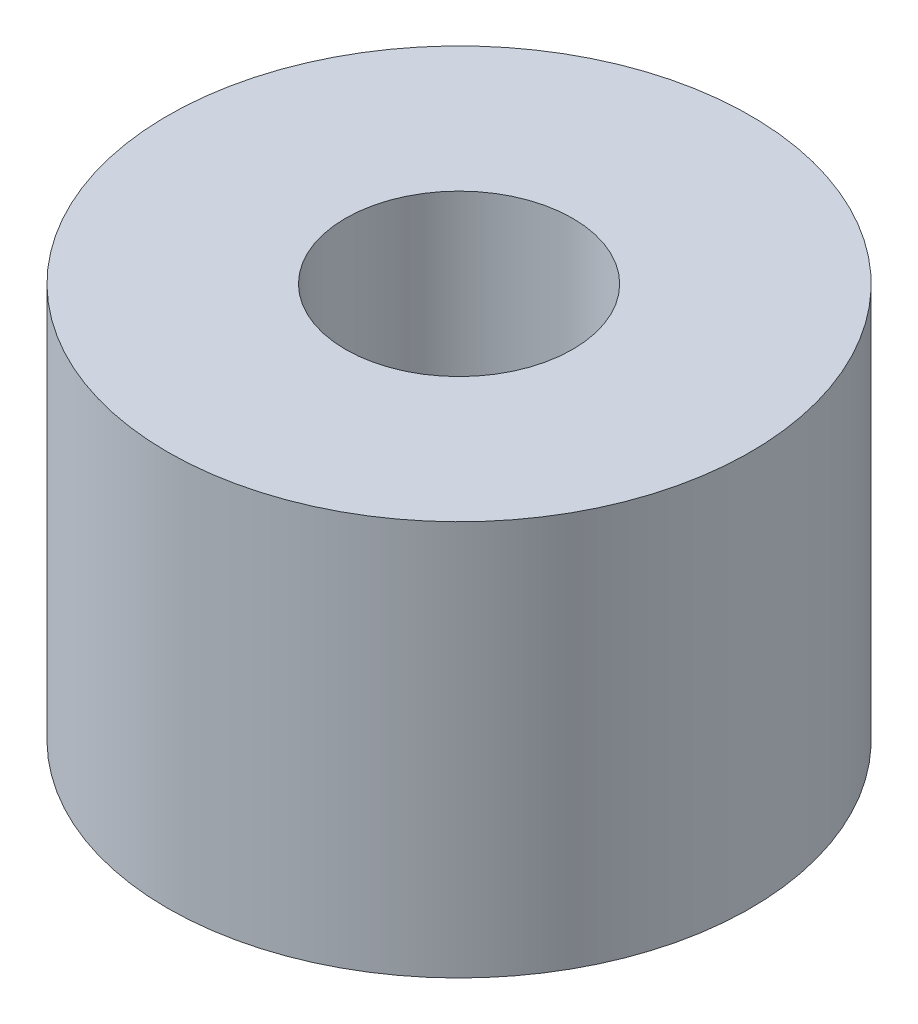
ISO-10303-21;
HEADER;
FILE_DESCRIPTION(('STEP AP214'),'2;1');
FILE_NAME('part.step','',(''),(''),'','','');
FILE_SCHEMA(('AUTOMOTIVE_DESIGN { 1 0 10303 214 1 1 1 1 }'));
ENDSEC;
DATA;
#1=APPLICATION_CONTEXT('core data for automotive mechanical design processes');
#2=APPLICATION_PROTOCOL_DEFINITION('international standard','automotive_design',2000,#1);
#3=PRODUCT_CONTEXT('',#1,'mechanical');
#4=PRODUCT('Part','Part','',(#3));
#5=PRODUCT_RELATED_PRODUCT_CATEGORY('part','',(#4));
#6=PRODUCT_DEFINITION_FORMATION('','',#4);
#7=PRODUCT_DEFINITION_CONTEXT('part definition',#1,'design');
#8=PRODUCT_DEFINITION('design','',#6,#7);
#9=PRODUCT_DEFINITION_SHAPE('','',#8);
#10=(LENGTH_UNIT() NAMED_UNIT(*) SI_UNIT(.MILLI.,.METRE.));
#11=(NAMED_UNIT(*) PLANE_ANGLE_UNIT() SI_UNIT($,.RADIAN.));
#12=(NAMED_UNIT(*) SI_UNIT($,.STERADIAN.) SOLID_ANGLE_UNIT());
#13=UNCERTAINTY_MEASURE_WITH_UNIT(LENGTH_MEASURE(1.E-05),#10,'distance_accuracy_value','');
#14=(GEOMETRIC_REPRESENTATION_CONTEXT(3) GLOBAL_UNCERTAINTY_ASSIGNED_CONTEXT((#13)) GLOBAL_UNIT_ASSIGNED_CONTEXT((#10,
#11,#12)) REPRESENTATION_CONTEXT('',''));
#15=CARTESIAN_POINT('',(0.,0.,0.));
#16=DIRECTION('',(0.,0.,1.));
#17=DIRECTION('',(1.,0.,0.));
#18=AXIS2_PLACEMENT_3D('',#15,#16,#17);
#19=CARTESIAN_POINT('',(0.,4.,0.));
#20=DIRECTION('',(0.,1.,0.));
#21=DIRECTION('',(0.,0.,1.));
#22=AXIS2_PLACEMENT_3D('',#19,#20,#21);
#23=PLANE('',#22);
#24=CARTESIAN_POINT('',(0.,4.,0.));
#25=DIRECTION('',(0.,1.,0.));
#26=DIRECTION('',(0.,0.,1.));
#27=AXIS2_PLACEMENT_3D('',#24,#25,#26);
#28=CIRCLE('',#27,2.95);
#29=CARTESIAN_POINT('',(0.,4.,2.95));
#30=VERTEX_POINT('',#29);
#31=EDGE_CURVE('E10',#30,#30,#28,.T.);
#32=ORIENTED_EDGE('',*,*,#31,.T.);
#33=EDGE_LOOP('',(#32));
#34=FACE_BOUND('',#33,.T.);
#35=CARTESIAN_POINT('',(0.,4.,0.));
#36=DIRECTION('',(0.,1.,0.));
#37=DIRECTION('',(0.,0.,1.));
#38=AXIS2_PLACEMENT_3D('',#35,#36,#37);
#39=CIRCLE('',#38,1.15);
#40=CARTESIAN_POINT('',(0.,4.,1.15));
#41=VERTEX_POINT('',#40);
#42=EDGE_CURVE('E41',#41,#41,#39,.T.);
#43=ORIENTED_EDGE('',*,*,#42,.F.);
#44=EDGE_LOOP('',(#43));
#45=FACE_BOUND('',#44,.T.);
#46=ADVANCED_FACE('F30',(#34,#45),#23,.T.);
#47=CARTESIAN_POINT('',(0.,0.,0.));
#48=DIRECTION('',(0.,1.,0.));
#49=DIRECTION('',(0.,0.,1.));
#50=AXIS2_PLACEMENT_3D('',#47,#48,#49);
#51=PLANE('',#50);
#52=CARTESIAN_POINT('',(0.,0.,0.));
#53=DIRECTION('',(0.,1.,0.));
#54=DIRECTION('',(0.,0.,1.));
#55=AXIS2_PLACEMENT_3D('',#52,#53,#54);
#56=CIRCLE('',#55,2.95);
#57=CARTESIAN_POINT('',(0.,0.,2.95));
#58=VERTEX_POINT('',#57);
#59=EDGE_CURVE('E34',#58,#58,#56,.T.);
#60=ORIENTED_EDGE('',*,*,#59,.F.);
#61=EDGE_LOOP('',(#60));
#62=FACE_BOUND('',#61,.T.);
#63=CARTESIAN_POINT('',(0.,0.,0.));
#64=DIRECTION('',(0.,1.,0.));
#65=DIRECTION('',(0.,0.,1.));
#66=AXIS2_PLACEMENT_3D('',#63,#64,#65);
#67=CIRCLE('',#66,1.15);
#68=CARTESIAN_POINT('',(0.,0.,1.15));
#69=VERTEX_POINT('',#68);
#70=EDGE_CURVE('E43',#69,#69,#67,.T.);
#71=ORIENTED_EDGE('',*,*,#70,.T.);
#72=EDGE_LOOP('',(#71));
#73=FACE_BOUND('',#72,.T.);
#74=ADVANCED_FACE('F53',(#62,#73),#51,.F.);
#75=CARTESIAN_POINT('',(0.,4.,0.));
#76=DIRECTION('',(0.,-1.,0.));
#77=DIRECTION('',(0.,0.,-1.));
#78=AXIS2_PLACEMENT_3D('',#75,#76,#77);
#79=CYLINDRICAL_SURFACE('',#78,2.95);
#80=ORIENTED_EDGE('',*,*,#31,.F.);
#81=EDGE_LOOP('',(#80));
#82=FACE_BOUND('',#81,.T.);
#83=ORIENTED_EDGE('',*,*,#59,.T.);
#84=EDGE_LOOP('',(#83));
#85=FACE_BOUND('',#84,.T.);
#86=ADVANCED_FACE('F32',(#82,#85),#79,.T.);
#87=CARTESIAN_POINT('',(0.,4.,0.));
#88=DIRECTION('',(0.,-1.,0.));
#89=DIRECTION('',(0.,0.,-1.));
#90=AXIS2_PLACEMENT_3D('',#87,#88,#89);
#91=CYLINDRICAL_SURFACE('',#90,1.15);
#92=ORIENTED_EDGE('',*,*,#42,.T.);
#93=EDGE_LOOP('',(#92));
#94=FACE_BOUND('',#93,.T.);
#95=ORIENTED_EDGE('',*,*,#70,.F.);
#96=EDGE_LOOP('',(#95));
#97=FACE_BOUND('',#96,.T.);
#98=ADVANCED_FACE('F49',(#94,#97),#91,.F.);
#99=CLOSED_SHELL('',(#46,#74,#86,#98));
#100=MANIFOLD_SOLID_BREP('B2',#99);
#101=ADVANCED_BREP_SHAPE_REPRESENTATION('',(#18,#100),#14);
#102=SHAPE_DEFINITION_REPRESENTATION(#9,#101);
ENDSEC;
END-ISO-10303-21;
